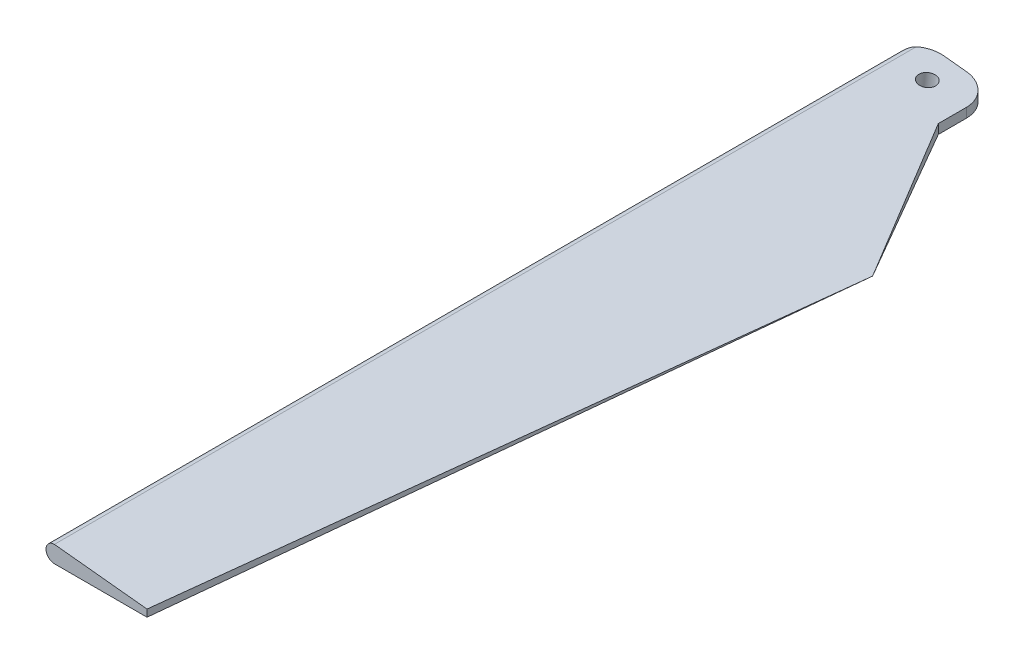
ISO-10303-21;
HEADER;
FILE_DESCRIPTION(('STEP AP214'),'2;1');
FILE_NAME('part.step','',(''),(''),'','','');
FILE_SCHEMA(('AUTOMOTIVE_DESIGN { 1 0 10303 214 1 1 1 1 }'));
ENDSEC;
DATA;
#1=APPLICATION_CONTEXT('core data for automotive mechanical design processes');
#2=APPLICATION_PROTOCOL_DEFINITION('international standard','automotive_design',2000,#1);
#3=PRODUCT_CONTEXT('',#1,'mechanical');
#4=PRODUCT('Part','Part','',(#3));
#5=PRODUCT_RELATED_PRODUCT_CATEGORY('part','',(#4));
#6=PRODUCT_DEFINITION_FORMATION('','',#4);
#7=PRODUCT_DEFINITION_CONTEXT('part definition',#1,'design');
#8=PRODUCT_DEFINITION('design','',#6,#7);
#9=PRODUCT_DEFINITION_SHAPE('','',#8);
#10=(LENGTH_UNIT() NAMED_UNIT(*) SI_UNIT(.MILLI.,.METRE.));
#11=(NAMED_UNIT(*) PLANE_ANGLE_UNIT() SI_UNIT($,.RADIAN.));
#12=(NAMED_UNIT(*) SI_UNIT($,.STERADIAN.) SOLID_ANGLE_UNIT());
#13=UNCERTAINTY_MEASURE_WITH_UNIT(LENGTH_MEASURE(1.E-05),#10,'distance_accuracy_value','');
#14=(GEOMETRIC_REPRESENTATION_CONTEXT(3) GLOBAL_UNCERTAINTY_ASSIGNED_CONTEXT((#13)) GLOBAL_UNIT_ASSIGNED_CONTEXT((#10,
#11,#12)) REPRESENTATION_CONTEXT('',''));
#15=CARTESIAN_POINT('',(0.,0.,0.));
#16=DIRECTION('',(0.,0.,1.));
#17=DIRECTION('',(1.,0.,0.));
#18=AXIS2_PLACEMENT_3D('',#15,#16,#17);
#19=CARTESIAN_POINT('',(0.,1.5,-155.));
#20=DIRECTION('',(0.,0.,1.));
#21=DIRECTION('',(1.,0.,0.));
#22=AXIS2_PLACEMENT_3D('',#19,#20,#21);
#23=PLANE('',#22);
#24=DIRECTION('',(0.,-1.,0.));
#25=VECTOR('',#24,1.);
#26=CARTESIAN_POINT('',(7.5,155.,-155.));
#27=LINE('',#26,#25);
#28=CARTESIAN_POINT('',(7.49999999999996,0.,-155.));
#29=VERTEX_POINT('',#28);
#30=CARTESIAN_POINT('',(7.49999999999997,2.21052631578947,-155.));
#31=VERTEX_POINT('',#30);
#32=EDGE_CURVE('E12',#29,#31,#27,.F.);
#33=ORIENTED_EDGE('',*,*,#32,.F.);
#34=DIRECTION('',(1.,0.,0.));
#35=VECTOR('',#34,1.);
#36=CARTESIAN_POINT('',(0.,0.,-155.));
#37=LINE('',#36,#35);
#38=CARTESIAN_POINT('',(3.50000000000004,0.,-155.));
#39=VERTEX_POINT('',#38);
#40=EDGE_CURVE('E126',#39,#29,#37,.T.);
#41=ORIENTED_EDGE('',*,*,#40,.F.);
#42=DIRECTION('',(0.,-1.,0.));
#43=VECTOR('',#42,1.);
#44=CARTESIAN_POINT('',(3.50000000000004,155.,-155.));
#45=LINE('',#44,#43);
#46=CARTESIAN_POINT('',(3.50000000000004,2.63157894736841,-155.));
#47=VERTEX_POINT('',#46);
#48=EDGE_CURVE('E49',#39,#47,#45,.F.);
#49=ORIENTED_EDGE('',*,*,#48,.T.);
#50=DIRECTION('',(-0.994505452921406,0.104684784518043,0.));
#51=VECTOR('',#50,1.);
#52=CARTESIAN_POINT('',(28.5,0.,-155.));
#53=LINE('',#52,#51);
#54=EDGE_CURVE('E185',#31,#47,#53,.T.);
#55=ORIENTED_EDGE('',*,*,#54,.F.);
#56=EDGE_LOOP('',(#33,#41,#49,#55));
#57=FACE_BOUND('',#56,.T.);
#58=ADVANCED_FACE('F39',(#57),#23,.F.);
#59=CARTESIAN_POINT('',(28.5,0.,-155.));
#60=DIRECTION('',(0.104684784518043,0.994505452921406,0.));
#61=DIRECTION('',(-0.994505452921406,0.104684784518043,0.));
#62=AXIS2_PLACEMENT_3D('',#59,#60,#61);
#63=PLANE('',#62);
#64=CARTESIAN_POINT('',(5.53846182955016,2.41700401794209,-150.));
#65=DIRECTION('',(0.104684784518043,0.994505452921406,0.));
#66=DIRECTION('',(-0.994505452921406,0.104684784518043,0.));
#67=AXIS2_PLACEMENT_3D('',#64,#65,#66);
#68=CIRCLE('',#67,1.5);
#69=CARTESIAN_POINT('',(4.04670365016805,2.57403119471915,-150.));
#70=VERTEX_POINT('',#69);
#71=EDGE_CURVE('E131',#70,#70,#68,.T.);
#72=ORIENTED_EDGE('',*,*,#71,.F.);
#73=EDGE_LOOP('',(#72));
#74=FACE_BOUND('',#73,.T.);
#75=CARTESIAN_POINT('',(7.5,2.21052631578947,-150.));
#76=DIRECTION('',(0.104684784518043,0.994505452921406,0.));
#77=DIRECTION('',(0.994505452921406,-0.104684784518043,0.));
#78=AXIS2_PLACEMENT_3D('',#75,#76,#77);
#79=ELLIPSE('',#78,5.02762451961653,5.);
#80=CARTESIAN_POINT('',(12.5,1.68421052631579,-150.));
#81=VERTEX_POINT('',#80);
#82=EDGE_CURVE('E107',#31,#81,#79,.F.);
#83=ORIENTED_EDGE('',*,*,#82,.F.);
#84=ORIENTED_EDGE('',*,*,#54,.T.);
#85=CARTESIAN_POINT('',(3.50000000000004,2.6315789473684,-150.));
#86=DIRECTION('',(0.104684784518043,0.994505452921406,0.));
#87=DIRECTION('',(0.994505452921406,-0.104684784518043,0.));
#88=AXIS2_PLACEMENT_3D('',#85,#86,#87);
#89=ELLIPSE('',#88,5.02762451961657,5.00000000000005);
#90=CARTESIAN_POINT('',(0.,3.,-153.570714214271));
#91=VERTEX_POINT('',#90);
#92=EDGE_CURVE('E63',#91,#47,#89,.F.);
#93=ORIENTED_EDGE('',*,*,#92,.F.);
#94=DIRECTION('',(0.,0.,1.));
#95=VECTOR('',#94,1.);
#96=CARTESIAN_POINT('',(0.,3.,-155.));
#97=LINE('',#96,#95);
#98=CARTESIAN_POINT('',(0.,3.,0.));
#99=VERTEX_POINT('',#98);
#100=EDGE_CURVE('E190',#91,#99,#97,.T.);
#101=ORIENTED_EDGE('',*,*,#100,.T.);
#102=DIRECTION('',(-0.994505452921406,0.104684784518043,0.));
#103=VECTOR('',#102,1.);
#104=CARTESIAN_POINT('',(28.5,0.,0.));
#105=LINE('',#104,#103);
#106=CARTESIAN_POINT('',(16.5,1.26315789473684,0.));
#107=VERTEX_POINT('',#106);
#108=EDGE_CURVE('E192',#107,#99,#105,.T.);
#109=ORIENTED_EDGE('',*,*,#108,.F.);
#110=DIRECTION('',(0.101775789771195,-0.0107132410285468,-0.994749674583065));
#111=VECTOR('',#110,1.);
#112=CARTESIAN_POINT('',(32.3180992510789,-0.401905184324095,-154.605030507823));
#113=LINE('',#112,#111);
#114=CARTESIAN_POINT('',(28.5,0.,-117.287187078898));
#115=VERTEX_POINT('',#114);
#116=EDGE_CURVE('E200',#107,#115,#113,.T.);
#117=ORIENTED_EDGE('',*,*,#116,.T.);
#118=DIRECTION('',(-0.499308914666259,0.0525588331227641,-0.864828408874024));
#119=VECTOR('',#118,1.);
#120=CARTESIAN_POINT('',(12.2149838291964,1.71421222850564,-145.493662488811));
#121=LINE('',#120,#119);
#122=CARTESIAN_POINT('',(12.5,1.68421052631579,-145.));
#123=VERTEX_POINT('',#122);
#124=EDGE_CURVE('E110',#115,#123,#121,.T.);
#125=ORIENTED_EDGE('',*,*,#124,.T.);
#126=DIRECTION('',(0.,0.,-1.));
#127=VECTOR('',#126,1.);
#128=CARTESIAN_POINT('',(12.5,1.68421052631579,-155.));
#129=LINE('',#128,#127);
#130=EDGE_CURVE('E186',#123,#81,#129,.T.);
#131=ORIENTED_EDGE('',*,*,#130,.T.);
#132=EDGE_LOOP('',(#83,#84,#93,#101,#109,#117,#125,#131));
#133=FACE_BOUND('',#132,.T.);
#134=ADVANCED_FACE('F163',(#74,#133),#63,.T.);
#135=CARTESIAN_POINT('',(0.,0.,-155.));
#136=DIRECTION('',(0.,-1.,0.));
#137=DIRECTION('',(0.,0.,-1.));
#138=AXIS2_PLACEMENT_3D('',#135,#136,#137);
#139=PLANE('',#138);
#140=CARTESIAN_POINT('',(5.28404035397731,0.,-150.));
#141=DIRECTION('',(0.,-1.,0.));
#142=DIRECTION('',(1.,0.,0.));
#143=AXIS2_PLACEMENT_3D('',#140,#141,#142);
#144=ELLIPSE('',#143,1.50828735588496,1.5);
#145=CARTESIAN_POINT('',(6.79232770986227,0.,-150.));
#146=VERTEX_POINT('',#145);
#147=EDGE_CURVE('E44',#146,#146,#144,.T.);
#148=ORIENTED_EDGE('',*,*,#147,.F.);
#149=EDGE_LOOP('',(#148));
#150=FACE_BOUND('',#149,.T.);
#151=CARTESIAN_POINT('',(7.5,0.,-150.));
#152=DIRECTION('',(0.,1.,0.));
#153=DIRECTION('',(0.,0.,1.));
#154=AXIS2_PLACEMENT_3D('',#151,#152,#153);
#155=CIRCLE('',#154,5.);
#156=CARTESIAN_POINT('',(12.5,0.,-150.));
#157=VERTEX_POINT('',#156);
#158=EDGE_CURVE('E55',#157,#29,#155,.T.);
#159=ORIENTED_EDGE('',*,*,#158,.F.);
#160=DIRECTION('',(0.,0.,1.));
#161=VECTOR('',#160,1.);
#162=CARTESIAN_POINT('',(12.5,0.,0.));
#163=LINE('',#162,#161);
#164=CARTESIAN_POINT('',(12.5,0.,-145.));
#165=VERTEX_POINT('',#164);
#166=EDGE_CURVE('E114',#157,#165,#163,.T.);
#167=ORIENTED_EDGE('',*,*,#166,.T.);
#168=DIRECTION('',(0.500000000000004,0.,0.866025403784436));
#169=VECTOR('',#168,1.);
#170=CARTESIAN_POINT('',(72.1618417743721,0.,-41.6626587736534));
#171=LINE('',#170,#169);
#172=EDGE_CURVE('E120',#165,#115,#171,.T.);
#173=ORIENTED_EDGE('',*,*,#172,.T.);
#174=DIRECTION('',(-0.101781630857502,0.,0.994806764964929));
#175=VECTOR('',#174,1.);
#176=CARTESIAN_POINT('',(16.3290682437298,0.,1.67067540628239));
#177=LINE('',#176,#175);
#178=CARTESIAN_POINT('',(16.5,0.,0.));
#179=VERTEX_POINT('',#178);
#180=EDGE_CURVE('E220',#115,#179,#177,.T.);
#181=ORIENTED_EDGE('',*,*,#180,.T.);
#182=DIRECTION('',(1.,0.,0.));
#183=VECTOR('',#182,1.);
#184=CARTESIAN_POINT('',(0.,0.,0.));
#185=LINE('',#184,#183);
#186=CARTESIAN_POINT('',(0.,0.,0.));
#187=VERTEX_POINT('',#186);
#188=EDGE_CURVE('E199',#187,#179,#185,.T.);
#189=ORIENTED_EDGE('',*,*,#188,.F.);
#190=DIRECTION('',(0.,0.,1.));
#191=VECTOR('',#190,1.);
#192=CARTESIAN_POINT('',(0.,0.,-155.));
#193=LINE('',#192,#191);
#194=CARTESIAN_POINT('',(0.,0.,-153.570714214271));
#195=VERTEX_POINT('',#194);
#196=EDGE_CURVE('E188',#195,#187,#193,.T.);
#197=ORIENTED_EDGE('',*,*,#196,.F.);
#198=CARTESIAN_POINT('',(3.50000000000004,0.,-150.));
#199=DIRECTION('',(0.,1.,0.));
#200=DIRECTION('',(0.,0.,1.));
#201=AXIS2_PLACEMENT_3D('',#198,#199,#200);
#202=CIRCLE('',#201,5.00000000000005);
#203=EDGE_CURVE('E127',#39,#195,#202,.T.);
#204=ORIENTED_EDGE('',*,*,#203,.F.);
#205=ORIENTED_EDGE('',*,*,#40,.T.);
#206=EDGE_LOOP('',(#159,#167,#173,#181,#189,#197,#204,#205));
#207=FACE_BOUND('',#206,.T.);
#208=ADVANCED_FACE('F123',(#150,#207),#139,.T.);
#209=CARTESIAN_POINT('',(0.,1.5,0.));
#210=DIRECTION('',(0.,0.,1.));
#211=DIRECTION('',(1.,0.,0.));
#212=AXIS2_PLACEMENT_3D('',#209,#210,#211);
#213=PLANE('',#212);
#214=ORIENTED_EDGE('',*,*,#188,.T.);
#215=DIRECTION('',(0.,1.,0.));
#216=VECTOR('',#215,1.);
#217=CARTESIAN_POINT('',(16.5,1.5,0.));
#218=LINE('',#217,#216);
#219=EDGE_CURVE('E205',#179,#107,#218,.T.);
#220=ORIENTED_EDGE('',*,*,#219,.T.);
#221=ORIENTED_EDGE('',*,*,#108,.T.);
#222=CARTESIAN_POINT('',(0.,1.5,0.));
#223=DIRECTION('',(0.,0.,1.));
#224=DIRECTION('',(1.,0.,0.));
#225=AXIS2_PLACEMENT_3D('',#222,#223,#224);
#226=CIRCLE('',#225,1.5);
#227=EDGE_CURVE('E196',#99,#187,#226,.T.);
#228=ORIENTED_EDGE('',*,*,#227,.T.);
#229=EDGE_LOOP('',(#214,#220,#221,#228));
#230=FACE_BOUND('',#229,.T.);
#231=ADVANCED_FACE('F165',(#230),#213,.T.);
#232=CARTESIAN_POINT('',(0.,1.5,-155.));
#233=DIRECTION('',(0.,0.,1.));
#234=DIRECTION('',(1.,0.,0.));
#235=AXIS2_PLACEMENT_3D('',#232,#233,#234);
#236=CYLINDRICAL_SURFACE('',#235,1.5);
#237=CARTESIAN_POINT('',(0.,0.,-153.570714214271));
#238=CARTESIAN_POINT('',(-0.0598921062509576,2.02098238971852E-05,-153.512027564635));
#239=CARTESIAN_POINT('',(-0.118231598402086,0.00358419425187895,-153.451871369777));
#240=CARTESIAN_POINT('',(-0.231404969887834,0.0168597586490353,-153.329193626642));
#241=CARTESIAN_POINT('',(-0.286245352893118,0.0265595447065134,-153.266676832077));
#242=CARTESIAN_POINT('',(-0.391765812488418,0.0510610904643957,-153.14020578511));
#243=CARTESIAN_POINT('',(-0.442479429793251,0.0658152457859545,-153.076269972943));
#244=CARTESIAN_POINT('',(-0.540227359276128,0.0997029020747723,-152.946718680692));
#245=CARTESIAN_POINT('',(-0.587259249713446,0.118839253587834,-152.8811021321));
#246=CARTESIAN_POINT('',(-0.699796267347519,0.171162550591365,-152.71588507646));
#247=CARTESIAN_POINT('',(-0.763011412297565,0.206631182371503,-152.615441363483));
#248=CARTESIAN_POINT('',(-0.881193155082598,0.284067850925794,-152.412254669914));
#249=CARTESIAN_POINT('',(-0.936157335769412,0.326037784990454,-152.309511025641));
#250=CARTESIAN_POINT('',(-1.03832330097902,0.415328479930337,-152.101690364808));
#251=CARTESIAN_POINT('',(-1.08547936333246,0.462678197186141,-151.99660342916));
#252=CARTESIAN_POINT('',(-1.17189262388911,0.561398800068951,-151.785071318021));
#253=CARTESIAN_POINT('',(-1.21114779084479,0.612770715062884,-151.678625800712));
#254=CARTESIAN_POINT('',(-1.28905363166775,0.729171854895961,-151.443341219835));
#255=CARTESIAN_POINT('',(-1.32601730102087,0.794879395968831,-151.314276195323));
#256=CARTESIAN_POINT('',(-1.38921544999305,0.929381167323138,-151.055165216311));
#257=CARTESIAN_POINT('',(-1.41544683045926,0.998176282845376,-150.925118989496));
#258=CARTESIAN_POINT('',(-1.47827776435978,1.20709740894529,-150.534807703396));
#259=CARTESIAN_POINT('',(-1.49933755680958,1.35026668304739,-150.27337504306));
#260=CARTESIAN_POINT('',(-1.49999486679302,1.49547096133987,-150.00826886726));
#261=CARTESIAN_POINT('',(-1.49999999453203,1.49773551803223,-150.004134371741));
#262=CARTESIAN_POINT('',(-1.50000000000001,1.5,-150.));
#263=B_SPLINE_CURVE_WITH_KNOTS('',3,(#237,#238,#239,#240,#241,#242,#243,#244,#245,#246,#247,
#248,#249,#250,#251,#252,#253,#254,#255,#256,#257,#258,#259,#260,#261,#262),.UNSPECIFIED.,.F.,
.F.,(4,2,2,2,2,2,2,2,2,2,2,2,4),(0.,0.251339777604977,0.502197905178909,0.750755490959356,
0.999475220912609,1.3705121503435,1.74165756507228,2.11490482242018,2.48824791597584,
2.93616568282823,3.38421270333244,4.27684739529255,4.29098953929211),.UNSPECIFIED.);
#264=CARTESIAN_POINT('',(-1.5,1.5,-150.));
#265=VERTEX_POINT('',#264);
#266=EDGE_CURVE('E144',#195,#265,#263,.T.);
#267=ORIENTED_EDGE('',*,*,#266,.F.);
#268=ORIENTED_EDGE('',*,*,#196,.T.);
#269=ORIENTED_EDGE('',*,*,#227,.F.);
#270=ORIENTED_EDGE('',*,*,#100,.F.);
#271=CARTESIAN_POINT('',(0.,3.,-153.570714214271));
#272=CARTESIAN_POINT('',(-0.0598921062509544,2.9999797901761,-153.512027564635));
#273=CARTESIAN_POINT('',(-0.118231598402079,2.99641580574812,-153.451871369777));
#274=CARTESIAN_POINT('',(-0.231404969887829,2.98314024135097,-153.329193626642));
#275=CARTESIAN_POINT('',(-0.286245352893118,2.97344045529349,-153.266676832077));
#276=CARTESIAN_POINT('',(-0.391765812488421,2.9489389095356,-153.14020578511));
#277=CARTESIAN_POINT('',(-0.442479429793252,2.93418475421405,-153.076269972943));
#278=CARTESIAN_POINT('',(-0.540227359276134,2.90029709792523,-152.946718680692));
#279=CARTESIAN_POINT('',(-0.58725924971346,2.88116074641216,-152.8811021321));
#280=CARTESIAN_POINT('',(-0.699796267347537,2.82883744940863,-152.71588507646));
#281=CARTESIAN_POINT('',(-0.763011412297577,2.79336881762849,-152.615441363483));
#282=CARTESIAN_POINT('',(-0.881193155082608,2.7159321490742,-152.412254669914));
#283=CARTESIAN_POINT('',(-0.936157335769424,2.67396221500954,-152.309511025641));
#284=CARTESIAN_POINT('',(-1.03832330097903,2.58467152006966,-152.101690364808));
#285=CARTESIAN_POINT('',(-1.08547936333246,2.53732180281386,-151.99660342916));
#286=CARTESIAN_POINT('',(-1.17189262388911,2.43860119993104,-151.785071318021));
#287=CARTESIAN_POINT('',(-1.2111477908448,2.3872292849371,-151.678625800712));
#288=CARTESIAN_POINT('',(-1.28905363166777,2.27082814510401,-151.443341219835));
#289=CARTESIAN_POINT('',(-1.32601730102089,2.20512060403114,-151.314276195323));
#290=CARTESIAN_POINT('',(-1.38921544999306,2.07061883267684,-151.055165216311));
#291=CARTESIAN_POINT('',(-1.41544683045926,2.00182371715462,-150.925118989496));
#292=CARTESIAN_POINT('',(-1.47827776435978,1.79290259105467,-150.534807703396));
#293=CARTESIAN_POINT('',(-1.49933755680958,1.64973331695244,-150.273375043061));
#294=CARTESIAN_POINT('',(-1.49999486679302,1.50452903866013,-150.00826886726));
#295=CARTESIAN_POINT('',(-1.49999999453203,1.50226448196776,-150.004134371741));
#296=CARTESIAN_POINT('',(-1.50000000000001,1.5,-150.));
#297=B_SPLINE_CURVE_WITH_KNOTS('',3,(#271,#272,#273,#274,#275,#276,#277,#278,#279,#280,#281,
#282,#283,#284,#285,#286,#287,#288,#289,#290,#291,#292,#293,#294,#295,#296),.UNSPECIFIED.,.F.,
.F.,(4,2,2,2,2,2,2,2,2,2,2,2,4),(0.,0.251339777604949,0.502197905178911,0.750755490959382,
0.999475220912644,1.37051215034351,1.74165756507231,2.11490482242018,2.48824791597591,
2.93616568282832,3.38421270333247,4.27684739529256,4.29098953929211),.UNSPECIFIED.);
#298=EDGE_CURVE('E137',#265,#91,#297,.F.);
#299=ORIENTED_EDGE('',*,*,#298,.F.);
#300=EDGE_LOOP('',(#267,#268,#269,#270,#299));
#301=FACE_BOUND('',#300,.T.);
#302=ADVANCED_FACE('F41',(#301),#236,.T.);
#303=CARTESIAN_POINT('',(16.3290682437298,155.,1.67067540628239));
#304=DIRECTION('',(0.994806764964929,0.,0.101781630857502));
#305=DIRECTION('',(0.101781630857502,0.,-0.994806764964929));
#306=AXIS2_PLACEMENT_3D('',#303,#304,#305);
#307=PLANE('',#306);
#308=ORIENTED_EDGE('',*,*,#219,.F.);
#309=ORIENTED_EDGE('',*,*,#180,.F.);
#310=ORIENTED_EDGE('',*,*,#116,.F.);
#311=EDGE_LOOP('',(#308,#309,#310));
#312=FACE_BOUND('',#311,.T.);
#313=ADVANCED_FACE('F155',(#312),#307,.T.);
#314=CARTESIAN_POINT('',(3.50000000000004,155.,-150.));
#315=DIRECTION('',(0.,-1.,0.));
#316=DIRECTION('',(0.,0.,-1.));
#317=AXIS2_PLACEMENT_3D('',#314,#315,#316);
#318=CYLINDRICAL_SURFACE('',#317,5.00000000000005);
#319=ORIENTED_EDGE('',*,*,#92,.T.);
#320=ORIENTED_EDGE('',*,*,#48,.F.);
#321=ORIENTED_EDGE('',*,*,#203,.T.);
#322=ORIENTED_EDGE('',*,*,#266,.T.);
#323=ORIENTED_EDGE('',*,*,#298,.T.);
#324=EDGE_LOOP('',(#319,#320,#321,#322,#323));
#325=FACE_BOUND('',#324,.T.);
#326=ADVANCED_FACE('F150',(#325),#318,.T.);
#327=CARTESIAN_POINT('',(7.5,155.,-150.));
#328=DIRECTION('',(0.,-1.,0.));
#329=DIRECTION('',(0.,0.,-1.));
#330=AXIS2_PLACEMENT_3D('',#327,#328,#329);
#331=CYLINDRICAL_SURFACE('',#330,5.);
#332=ORIENTED_EDGE('',*,*,#82,.T.);
#333=DIRECTION('',(0.,-1.,0.));
#334=VECTOR('',#333,1.);
#335=CARTESIAN_POINT('',(12.5,155.,-150.));
#336=LINE('',#335,#334);
#337=EDGE_CURVE('E103',#81,#157,#336,.T.);
#338=ORIENTED_EDGE('',*,*,#337,.T.);
#339=ORIENTED_EDGE('',*,*,#158,.T.);
#340=ORIENTED_EDGE('',*,*,#32,.T.);
#341=EDGE_LOOP('',(#332,#338,#339,#340));
#342=FACE_BOUND('',#341,.T.);
#343=ADVANCED_FACE('F105',(#342),#331,.T.);
#344=CARTESIAN_POINT('',(12.5,155.,0.));
#345=DIRECTION('',(1.,0.,0.));
#346=DIRECTION('',(0.,0.,-1.));
#347=AXIS2_PLACEMENT_3D('',#344,#345,#346);
#348=PLANE('',#347);
#349=DIRECTION('',(0.,-1.,0.));
#350=VECTOR('',#349,1.);
#351=CARTESIAN_POINT('',(12.5,155.,-145.));
#352=LINE('',#351,#350);
#353=EDGE_CURVE('E111',#123,#165,#352,.T.);
#354=ORIENTED_EDGE('',*,*,#353,.T.);
#355=ORIENTED_EDGE('',*,*,#166,.F.);
#356=ORIENTED_EDGE('',*,*,#337,.F.);
#357=ORIENTED_EDGE('',*,*,#130,.F.);
#358=EDGE_LOOP('',(#354,#355,#356,#357));
#359=FACE_BOUND('',#358,.T.);
#360=ADVANCED_FACE('F115',(#359),#348,.T.);
#361=CARTESIAN_POINT('',(72.1618417743721,155.,-41.6626587736534));
#362=DIRECTION('',(0.866025403784436,0.,-0.500000000000004));
#363=DIRECTION('',(-0.500000000000004,0.,-0.866025403784436));
#364=AXIS2_PLACEMENT_3D('',#361,#362,#363);
#365=PLANE('',#364);
#366=ORIENTED_EDGE('',*,*,#172,.F.);
#367=ORIENTED_EDGE('',*,*,#353,.F.);
#368=ORIENTED_EDGE('',*,*,#124,.F.);
#369=EDGE_LOOP('',(#366,#367,#368));
#370=FACE_BOUND('',#369,.T.);
#371=ADVANCED_FACE('F224',(#370),#365,.T.);
#372=CARTESIAN_POINT('',(-10.6876797707465,-151.731341184876,-150.));
#373=DIRECTION('',(0.104684784518043,0.994505452921406,0.));
#374=DIRECTION('',(-0.994505452921406,0.104684784518043,0.));
#375=AXIS2_PLACEMENT_3D('',#372,#373,#374);
#376=CYLINDRICAL_SURFACE('',#375,1.5);
#377=ORIENTED_EDGE('',*,*,#147,.T.);
#378=EDGE_LOOP('',(#377));
#379=FACE_BOUND('',#378,.T.);
#380=ORIENTED_EDGE('',*,*,#71,.T.);
#381=EDGE_LOOP('',(#380));
#382=FACE_BOUND('',#381,.T.);
#383=ADVANCED_FACE('F181',(#379,#382),#376,.F.);
#384=CLOSED_SHELL('',(#58,#134,#208,#231,#302,#313,#326,#343,#360,#371,#383));
#385=MANIFOLD_SOLID_BREP('B2',#384);
#386=ADVANCED_BREP_SHAPE_REPRESENTATION('',(#18,#385),#14);
#387=SHAPE_DEFINITION_REPRESENTATION(#9,#386);
ENDSEC;
END-ISO-10303-21;
